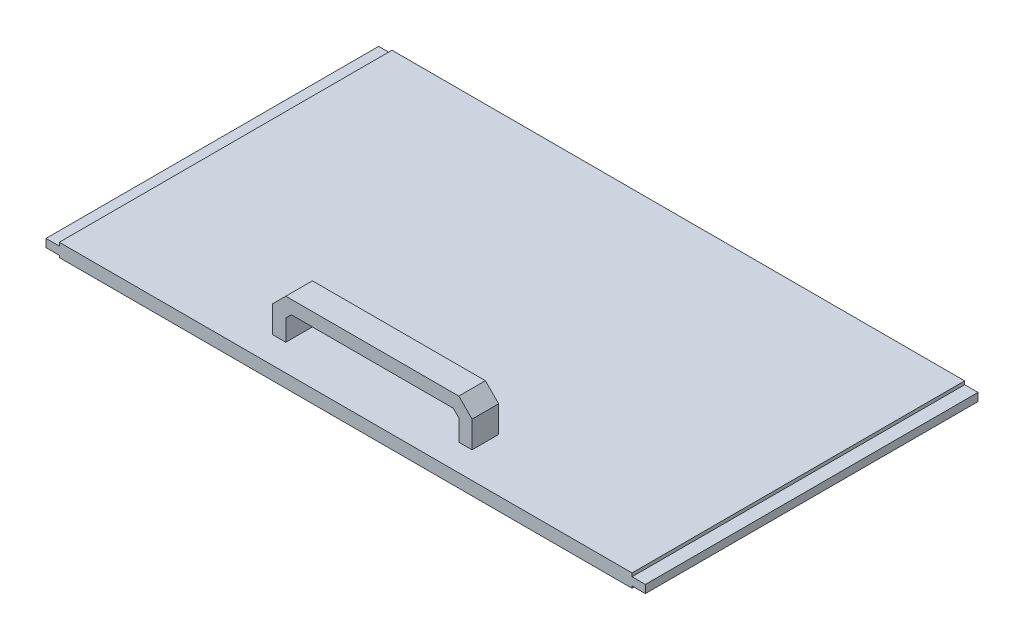
ISO-10303-21;
HEADER;
FILE_DESCRIPTION(('STEP AP214'),'2;1');
FILE_NAME('part.step','',(''),(''),'','','');
FILE_SCHEMA(('AUTOMOTIVE_DESIGN { 1 0 10303 214 1 1 1 1 }'));
ENDSEC;
DATA;
#1=APPLICATION_CONTEXT('core data for automotive mechanical design processes');
#2=APPLICATION_PROTOCOL_DEFINITION('international standard','automotive_design',2000,#1);
#3=PRODUCT_CONTEXT('',#1,'mechanical');
#4=PRODUCT('Part','Part','',(#3));
#5=PRODUCT_RELATED_PRODUCT_CATEGORY('part','',(#4));
#6=PRODUCT_DEFINITION_FORMATION('','',#4);
#7=PRODUCT_DEFINITION_CONTEXT('part definition',#1,'design');
#8=PRODUCT_DEFINITION('design','',#6,#7);
#9=PRODUCT_DEFINITION_SHAPE('','',#8);
#10=(LENGTH_UNIT() NAMED_UNIT(*) SI_UNIT(.MILLI.,.METRE.));
#11=(NAMED_UNIT(*) PLANE_ANGLE_UNIT() SI_UNIT($,.RADIAN.));
#12=(NAMED_UNIT(*) SI_UNIT($,.STERADIAN.) SOLID_ANGLE_UNIT());
#13=UNCERTAINTY_MEASURE_WITH_UNIT(LENGTH_MEASURE(1.E-05),#10,'distance_accuracy_value','');
#14=(GEOMETRIC_REPRESENTATION_CONTEXT(3) GLOBAL_UNCERTAINTY_ASSIGNED_CONTEXT((#13)) GLOBAL_UNIT_ASSIGNED_CONTEXT((#10,
#11,#12)) REPRESENTATION_CONTEXT('',''));
#15=CARTESIAN_POINT('',(0.,0.,0.));
#16=DIRECTION('',(0.,0.,1.));
#17=DIRECTION('',(1.,0.,0.));
#18=AXIS2_PLACEMENT_3D('',#15,#16,#17);
#19=CARTESIAN_POINT('',(0.,10.,0.));
#20=DIRECTION('',(0.,1.,0.));
#21=DIRECTION('',(0.,0.,1.));
#22=AXIS2_PLACEMENT_3D('',#19,#20,#21);
#23=PLANE('',#22);
#24=DIRECTION('',(1.,0.,0.));
#25=VECTOR('',#24,1.);
#26=CARTESIAN_POINT('',(-52.6814074074073,10.,106.184950617284));
#27=LINE('',#26,#25);
#28=CARTESIAN_POINT('',(87.3185925925926,10.,106.184950617284));
#29=VERTEX_POINT('',#28);
#30=CARTESIAN_POINT('',(97.3185925925927,10.,106.184950617284));
#31=VERTEX_POINT('',#30);
#32=EDGE_CURVE('E279',#29,#31,#27,.T.);
#33=ORIENTED_EDGE('',*,*,#32,.F.);
#34=DIRECTION('',(0.,0.,-1.));
#35=VECTOR('',#34,1.);
#36=CARTESIAN_POINT('',(87.3185925925926,10.,116.184950617284));
#37=LINE('',#36,#35);
#38=CARTESIAN_POINT('',(87.3185925925926,10.,86.1849506172838));
#39=VERTEX_POINT('',#38);
#40=EDGE_CURVE('E239',#29,#39,#37,.T.);
#41=ORIENTED_EDGE('',*,*,#40,.T.);
#42=DIRECTION('',(-1.,0.,0.));
#43=VECTOR('',#42,1.);
#44=CARTESIAN_POINT('',(97.3185925925926,10.,86.1849506172838));
#45=LINE('',#44,#43);
#46=CARTESIAN_POINT('',(97.3185925925926,10.,86.1849506172838));
#47=VERTEX_POINT('',#46);
#48=EDGE_CURVE('E271',#47,#39,#45,.T.);
#49=ORIENTED_EDGE('',*,*,#48,.F.);
#50=DIRECTION('',(0.,0.,-1.));
#51=VECTOR('',#50,1.);
#52=CARTESIAN_POINT('',(97.3185925925927,10.,106.184950617284));
#53=LINE('',#52,#51);
#54=EDGE_CURVE('E284',#31,#47,#53,.T.);
#55=ORIENTED_EDGE('',*,*,#54,.F.);
#56=EDGE_LOOP('',(#33,#41,#49,#55));
#57=FACE_BOUND('',#56,.T.);
#58=DIRECTION('',(0.,0.,-1.));
#59=VECTOR('',#58,1.);
#60=CARTESIAN_POINT('',(-42.6814074074074,10.,116.184950617284));
#61=LINE('',#60,#59);
#62=CARTESIAN_POINT('',(-42.6814074074074,10.,106.184950617284));
#63=VERTEX_POINT('',#62);
#64=CARTESIAN_POINT('',(-42.6814074074073,10.,86.1849506172839));
#65=VERTEX_POINT('',#64);
#66=EDGE_CURVE('E63',#63,#65,#61,.T.);
#67=ORIENTED_EDGE('',*,*,#66,.F.);
#68=CARTESIAN_POINT('',(-52.6814074074073,10.,106.184950617284));
#69=VERTEX_POINT('',#68);
#70=EDGE_CURVE('E280',#69,#63,#27,.T.);
#71=ORIENTED_EDGE('',*,*,#70,.F.);
#72=DIRECTION('',(0.,0.,1.));
#73=VECTOR('',#72,1.);
#74=CARTESIAN_POINT('',(-52.6814074074074,10.,86.1849506172839));
#75=LINE('',#74,#73);
#76=CARTESIAN_POINT('',(-52.6814074074074,10.,86.1849506172839));
#77=VERTEX_POINT('',#76);
#78=EDGE_CURVE('E266',#77,#69,#75,.T.);
#79=ORIENTED_EDGE('',*,*,#78,.F.);
#80=EDGE_CURVE('E288',#65,#77,#45,.T.);
#81=ORIENTED_EDGE('',*,*,#80,.F.);
#82=EDGE_LOOP('',(#67,#71,#79,#81));
#83=FACE_BOUND('',#82,.T.);
#84=DIRECTION('',(-1.,0.,0.));
#85=VECTOR('',#84,1.);
#86=CARTESIAN_POINT('',(237.533592592593,10.,-123.815049382716));
#87=LINE('',#86,#85);
#88=CARTESIAN_POINT('',(237.533592592593,10.,-123.815049382716));
#89=VERTEX_POINT('',#88);
#90=CARTESIAN_POINT('',(-192.896407407407,10.,-123.815049382716));
#91=VERTEX_POINT('',#90);
#92=EDGE_CURVE('E378',#89,#91,#87,.T.);
#93=ORIENTED_EDGE('',*,*,#92,.T.);
#94=DIRECTION('',(0.,0.,1.));
#95=VECTOR('',#94,1.);
#96=CARTESIAN_POINT('',(-192.896407407407,10.,-123.815049382716));
#97=LINE('',#96,#95);
#98=CARTESIAN_POINT('',(-192.896407407407,10.,126.184950617284));
#99=VERTEX_POINT('',#98);
#100=EDGE_CURVE('E382',#91,#99,#97,.T.);
#101=ORIENTED_EDGE('',*,*,#100,.T.);
#102=DIRECTION('',(1.,0.,0.));
#103=VECTOR('',#102,1.);
#104=CARTESIAN_POINT('',(-192.896407407407,10.,126.184950617284));
#105=LINE('',#104,#103);
#106=CARTESIAN_POINT('',(237.533592592593,10.,126.184950617284));
#107=VERTEX_POINT('',#106);
#108=EDGE_CURVE('E386',#99,#107,#105,.T.);
#109=ORIENTED_EDGE('',*,*,#108,.T.);
#110=DIRECTION('',(0.,0.,-1.));
#111=VECTOR('',#110,1.);
#112=CARTESIAN_POINT('',(237.533592592593,10.,126.184950617284));
#113=LINE('',#112,#111);
#114=EDGE_CURVE('E389',#107,#89,#113,.T.);
#115=ORIENTED_EDGE('',*,*,#114,.T.);
#116=EDGE_LOOP('',(#93,#101,#109,#115));
#117=FACE_BOUND('',#116,.T.);
#118=ADVANCED_FACE('F41',(#57,#83,#117),#23,.T.);
#119=CARTESIAN_POINT('',(-192.896407407407,10.,-123.815049382716));
#120=DIRECTION('',(1.,0.,0.));
#121=DIRECTION('',(0.,0.,-1.));
#122=AXIS2_PLACEMENT_3D('',#119,#120,#121);
#123=PLANE('',#122);
#124=DIRECTION('',(0.,-1.,0.));
#125=VECTOR('',#124,1.);
#126=CARTESIAN_POINT('',(-192.896407407407,10.,-123.815049382716));
#127=LINE('',#126,#125);
#128=CARTESIAN_POINT('',(-192.896407407407,7.50000000000003,-123.815049382716));
#129=VERTEX_POINT('',#128);
#130=EDGE_CURVE('E421',#91,#129,#127,.T.);
#131=ORIENTED_EDGE('',*,*,#130,.T.);
#132=DIRECTION('',(0.,0.,1.));
#133=VECTOR('',#132,1.);
#134=CARTESIAN_POINT('',(-192.896407407407,7.50000000000003,-123.815049382716));
#135=LINE('',#134,#133);
#136=CARTESIAN_POINT('',(-192.896407407407,7.5,126.184950617284));
#137=VERTEX_POINT('',#136);
#138=EDGE_CURVE('E304',#129,#137,#135,.T.);
#139=ORIENTED_EDGE('',*,*,#138,.T.);
#140=DIRECTION('',(0.,-1.,0.));
#141=VECTOR('',#140,1.);
#142=CARTESIAN_POINT('',(-192.896407407407,10.,126.184950617284));
#143=LINE('',#142,#141);
#144=EDGE_CURVE('E416',#99,#137,#143,.T.);
#145=ORIENTED_EDGE('',*,*,#144,.F.);
#146=ORIENTED_EDGE('',*,*,#100,.F.);
#147=EDGE_LOOP('',(#131,#139,#145,#146));
#148=FACE_BOUND('',#147,.T.);
#149=ADVANCED_FACE('F527',(#148),#123,.F.);
#150=CARTESIAN_POINT('',(237.533592592593,10.,126.184950617284));
#151=DIRECTION('',(-1.,0.,0.));
#152=DIRECTION('',(0.,0.,1.));
#153=AXIS2_PLACEMENT_3D('',#150,#151,#152);
#154=PLANE('',#153);
#155=DIRECTION('',(0.,0.,1.));
#156=VECTOR('',#155,1.);
#157=CARTESIAN_POINT('',(237.533592592593,7.50000000000003,-123.815049382716));
#158=LINE('',#157,#156);
#159=CARTESIAN_POINT('',(237.533592592593,7.50000000000002,-123.815049382716));
#160=VERTEX_POINT('',#159);
#161=CARTESIAN_POINT('',(237.533592592593,7.50000000000002,126.184950617284));
#162=VERTEX_POINT('',#161);
#163=EDGE_CURVE('E340',#160,#162,#158,.T.);
#164=ORIENTED_EDGE('',*,*,#163,.F.);
#165=DIRECTION('',(0.,-1.,0.));
#166=VECTOR('',#165,1.);
#167=CARTESIAN_POINT('',(237.533592592593,10.,-123.815049382716));
#168=LINE('',#167,#166);
#169=EDGE_CURVE('E407',#89,#160,#168,.T.);
#170=ORIENTED_EDGE('',*,*,#169,.F.);
#171=ORIENTED_EDGE('',*,*,#114,.F.);
#172=DIRECTION('',(0.,-1.,0.));
#173=VECTOR('',#172,1.);
#174=CARTESIAN_POINT('',(237.533592592593,10.,126.184950617284));
#175=LINE('',#174,#173);
#176=EDGE_CURVE('E412',#107,#162,#175,.T.);
#177=ORIENTED_EDGE('',*,*,#176,.T.);
#178=EDGE_LOOP('',(#164,#170,#171,#177));
#179=FACE_BOUND('',#178,.T.);
#180=ADVANCED_FACE('F534',(#179),#154,.F.);
#181=DIRECTION('',(0.,0.,-1.));
#182=VECTOR('',#181,1.);
#183=CARTESIAN_POINT('',(237.533592592593,1.5,126.184950617284));
#184=LINE('',#183,#182);
#185=CARTESIAN_POINT('',(237.533592592593,1.5,126.184950617284));
#186=VERTEX_POINT('',#185);
#187=CARTESIAN_POINT('',(237.533592592593,1.5,-123.815049382716));
#188=VERTEX_POINT('',#187);
#189=EDGE_CURVE('E346',#186,#188,#184,.T.);
#190=ORIENTED_EDGE('',*,*,#189,.F.);
#191=CARTESIAN_POINT('',(237.533592592593,0.,126.184950617284));
#192=VERTEX_POINT('',#191);
#193=EDGE_CURVE('E411',#186,#192,#175,.T.);
#194=ORIENTED_EDGE('',*,*,#193,.T.);
#195=DIRECTION('',(0.,0.,-1.));
#196=VECTOR('',#195,1.);
#197=CARTESIAN_POINT('',(237.533592592593,0.,126.184950617284));
#198=LINE('',#197,#196);
#199=CARTESIAN_POINT('',(237.533592592593,0.,-123.815049382716));
#200=VERTEX_POINT('',#199);
#201=EDGE_CURVE('E383',#192,#200,#198,.T.);
#202=ORIENTED_EDGE('',*,*,#201,.T.);
#203=EDGE_CURVE('E392',#188,#200,#168,.T.);
#204=ORIENTED_EDGE('',*,*,#203,.F.);
#205=EDGE_LOOP('',(#190,#194,#202,#204));
#206=FACE_BOUND('',#205,.T.);
#207=ADVANCED_FACE('F508',(#206),#154,.F.);
#208=CARTESIAN_POINT('',(237.533592592593,10.,-123.815049382716));
#209=DIRECTION('',(0.,0.,1.));
#210=DIRECTION('',(1.,0.,0.));
#211=AXIS2_PLACEMENT_3D('',#208,#209,#210);
#212=PLANE('',#211);
#213=DIRECTION('',(-1.,0.,0.));
#214=VECTOR('',#213,1.);
#215=CARTESIAN_POINT('',(237.533592592593,0.,-123.815049382716));
#216=LINE('',#215,#214);
#217=CARTESIAN_POINT('',(-192.896407407407,0.,-123.815049382716));
#218=VERTEX_POINT('',#217);
#219=EDGE_CURVE('E377',#200,#218,#216,.T.);
#220=ORIENTED_EDGE('',*,*,#219,.T.);
#221=CARTESIAN_POINT('',(-192.896407407407,1.5,-123.815049382716));
#222=VERTEX_POINT('',#221);
#223=EDGE_CURVE('E420',#222,#218,#127,.T.);
#224=ORIENTED_EDGE('',*,*,#223,.F.);
#225=DIRECTION('',(1.,0.,0.));
#226=VECTOR('',#225,1.);
#227=CARTESIAN_POINT('',(-202.896407407407,1.5,-123.815049382716));
#228=LINE('',#227,#226);
#229=CARTESIAN_POINT('',(-202.896407407407,1.5,-123.815049382716));
#230=VERTEX_POINT('',#229);
#231=EDGE_CURVE('E334',#230,#222,#228,.T.);
#232=ORIENTED_EDGE('',*,*,#231,.F.);
#233=DIRECTION('',(0.,1.,0.));
#234=VECTOR('',#233,1.);
#235=CARTESIAN_POINT('',(-202.896407407407,1.5,-123.815049382716));
#236=LINE('',#235,#234);
#237=CARTESIAN_POINT('',(-202.896407407407,7.50000000000003,-123.815049382716));
#238=VERTEX_POINT('',#237);
#239=EDGE_CURVE('E309',#230,#238,#236,.T.);
#240=ORIENTED_EDGE('',*,*,#239,.T.);
#241=DIRECTION('',(1.,0.,0.));
#242=VECTOR('',#241,1.);
#243=CARTESIAN_POINT('',(-202.896407407407,7.50000000000003,-123.815049382716));
#244=LINE('',#243,#242);
#245=EDGE_CURVE('E337',#238,#129,#244,.T.);
#246=ORIENTED_EDGE('',*,*,#245,.T.);
#247=ORIENTED_EDGE('',*,*,#130,.F.);
#248=ORIENTED_EDGE('',*,*,#92,.F.);
#249=ORIENTED_EDGE('',*,*,#169,.T.);
#250=DIRECTION('',(-1.,0.,0.));
#251=VECTOR('',#250,1.);
#252=CARTESIAN_POINT('',(247.533592592593,7.50000000000003,-123.815049382716));
#253=LINE('',#252,#251);
#254=CARTESIAN_POINT('',(247.533592592593,7.50000000000003,-123.815049382716));
#255=VERTEX_POINT('',#254);
#256=EDGE_CURVE('E355',#255,#160,#253,.T.);
#257=ORIENTED_EDGE('',*,*,#256,.F.);
#258=DIRECTION('',(0.,1.,0.));
#259=VECTOR('',#258,1.);
#260=CARTESIAN_POINT('',(247.533592592593,1.5,-123.815049382716));
#261=LINE('',#260,#259);
#262=CARTESIAN_POINT('',(247.533592592593,1.5,-123.815049382716));
#263=VERTEX_POINT('',#262);
#264=EDGE_CURVE('E352',#263,#255,#261,.T.);
#265=ORIENTED_EDGE('',*,*,#264,.F.);
#266=DIRECTION('',(-1.,0.,0.));
#267=VECTOR('',#266,1.);
#268=CARTESIAN_POINT('',(247.533592592593,1.5,-123.815049382716));
#269=LINE('',#268,#267);
#270=EDGE_CURVE('E365',#263,#188,#269,.T.);
#271=ORIENTED_EDGE('',*,*,#270,.T.);
#272=ORIENTED_EDGE('',*,*,#203,.T.);
#273=EDGE_LOOP('',(#220,#224,#232,#240,#246,#247,#248,#249,#257,#265,#271,#272));
#274=FACE_BOUND('',#273,.T.);
#275=ADVANCED_FACE('F504',(#274),#212,.F.);
#276=CARTESIAN_POINT('',(-192.896407407407,1.5,126.184950617284));
#277=VERTEX_POINT('',#276);
#278=CARTESIAN_POINT('',(-192.896407407407,0.,126.184950617284));
#279=VERTEX_POINT('',#278);
#280=EDGE_CURVE('E415',#277,#279,#143,.T.);
#281=ORIENTED_EDGE('',*,*,#280,.F.);
#282=DIRECTION('',(0.,0.,-1.));
#283=VECTOR('',#282,1.);
#284=CARTESIAN_POINT('',(-192.896407407407,1.5,126.184950617284));
#285=LINE('',#284,#283);
#286=EDGE_CURVE('E310',#277,#222,#285,.T.);
#287=ORIENTED_EDGE('',*,*,#286,.T.);
#288=ORIENTED_EDGE('',*,*,#223,.T.);
#289=DIRECTION('',(0.,0.,1.));
#290=VECTOR('',#289,1.);
#291=CARTESIAN_POINT('',(-192.896407407407,0.,-123.815049382716));
#292=LINE('',#291,#290);
#293=EDGE_CURVE('E396',#218,#279,#292,.T.);
#294=ORIENTED_EDGE('',*,*,#293,.T.);
#295=EDGE_LOOP('',(#281,#287,#288,#294));
#296=FACE_BOUND('',#295,.T.);
#297=ADVANCED_FACE('F496',(#296),#123,.F.);
#298=CARTESIAN_POINT('',(-192.896407407407,10.,126.184950617284));
#299=DIRECTION('',(0.,0.,-1.));
#300=DIRECTION('',(-1.,0.,0.));
#301=AXIS2_PLACEMENT_3D('',#298,#299,#300);
#302=PLANE('',#301);
#303=DIRECTION('',(1.,0.,0.));
#304=VECTOR('',#303,1.);
#305=CARTESIAN_POINT('',(-192.896407407407,0.,126.184950617284));
#306=LINE('',#305,#304);
#307=EDGE_CURVE('E400',#279,#192,#306,.T.);
#308=ORIENTED_EDGE('',*,*,#307,.T.);
#309=ORIENTED_EDGE('',*,*,#193,.F.);
#310=DIRECTION('',(-1.,0.,0.));
#311=VECTOR('',#310,1.);
#312=CARTESIAN_POINT('',(247.533592592593,1.5,126.184950617284));
#313=LINE('',#312,#311);
#314=CARTESIAN_POINT('',(247.533592592593,1.5,126.184950617284));
#315=VERTEX_POINT('',#314);
#316=EDGE_CURVE('E369',#315,#186,#313,.T.);
#317=ORIENTED_EDGE('',*,*,#316,.F.);
#318=DIRECTION('',(0.,-1.,0.));
#319=VECTOR('',#318,1.);
#320=CARTESIAN_POINT('',(247.533592592593,7.5,126.184950617284));
#321=LINE('',#320,#319);
#322=CARTESIAN_POINT('',(247.533592592593,7.5,126.184950617284));
#323=VERTEX_POINT('',#322);
#324=EDGE_CURVE('E345',#323,#315,#321,.T.);
#325=ORIENTED_EDGE('',*,*,#324,.F.);
#326=DIRECTION('',(-1.,0.,0.));
#327=VECTOR('',#326,1.);
#328=CARTESIAN_POINT('',(247.533592592593,7.5,126.184950617284));
#329=LINE('',#328,#327);
#330=EDGE_CURVE('E373',#323,#162,#329,.T.);
#331=ORIENTED_EDGE('',*,*,#330,.T.);
#332=ORIENTED_EDGE('',*,*,#176,.F.);
#333=ORIENTED_EDGE('',*,*,#108,.F.);
#334=ORIENTED_EDGE('',*,*,#144,.T.);
#335=DIRECTION('',(1.,0.,0.));
#336=VECTOR('',#335,1.);
#337=CARTESIAN_POINT('',(-202.896407407407,7.5,126.184950617284));
#338=LINE('',#337,#336);
#339=CARTESIAN_POINT('',(-202.896407407407,7.5,126.184950617284));
#340=VERTEX_POINT('',#339);
#341=EDGE_CURVE('E322',#340,#137,#338,.T.);
#342=ORIENTED_EDGE('',*,*,#341,.F.);
#343=DIRECTION('',(0.,-1.,0.));
#344=VECTOR('',#343,1.);
#345=CARTESIAN_POINT('',(-202.896407407407,7.5,126.184950617284));
#346=LINE('',#345,#344);
#347=CARTESIAN_POINT('',(-202.896407407407,1.5,126.184950617284));
#348=VERTEX_POINT('',#347);
#349=EDGE_CURVE('E318',#340,#348,#346,.T.);
#350=ORIENTED_EDGE('',*,*,#349,.T.);
#351=DIRECTION('',(1.,0.,0.));
#352=VECTOR('',#351,1.);
#353=CARTESIAN_POINT('',(-202.896407407407,1.5,126.184950617284));
#354=LINE('',#353,#352);
#355=EDGE_CURVE('E331',#348,#277,#354,.T.);
#356=ORIENTED_EDGE('',*,*,#355,.T.);
#357=ORIENTED_EDGE('',*,*,#280,.T.);
#358=EDGE_LOOP('',(#308,#309,#317,#325,#331,#332,#333,#334,#342,#350,#356,#357));
#359=FACE_BOUND('',#358,.T.);
#360=ADVANCED_FACE('F512',(#359),#302,.F.);
#361=CARTESIAN_POINT('',(0.,0.,0.));
#362=DIRECTION('',(0.,1.,0.));
#363=DIRECTION('',(0.,0.,1.));
#364=AXIS2_PLACEMENT_3D('',#361,#362,#363);
#365=PLANE('',#364);
#366=ORIENTED_EDGE('',*,*,#219,.F.);
#367=ORIENTED_EDGE('',*,*,#201,.F.);
#368=ORIENTED_EDGE('',*,*,#307,.F.);
#369=ORIENTED_EDGE('',*,*,#293,.F.);
#370=EDGE_LOOP('',(#366,#367,#368,#369));
#371=FACE_BOUND('',#370,.T.);
#372=ADVANCED_FACE('F502',(#371),#365,.F.);
#373=CARTESIAN_POINT('',(247.533592592593,7.50000000000003,-123.815049382716));
#374=DIRECTION('',(0.,-1.,0.));
#375=DIRECTION('',(0.,0.,-1.));
#376=AXIS2_PLACEMENT_3D('',#373,#374,#375);
#377=PLANE('',#376);
#378=ORIENTED_EDGE('',*,*,#163,.T.);
#379=ORIENTED_EDGE('',*,*,#330,.F.);
#380=DIRECTION('',(0.,0.,1.));
#381=VECTOR('',#380,1.);
#382=CARTESIAN_POINT('',(247.533592592593,7.50000000000003,-123.815049382716));
#383=LINE('',#382,#381);
#384=EDGE_CURVE('E341',#255,#323,#383,.T.);
#385=ORIENTED_EDGE('',*,*,#384,.F.);
#386=ORIENTED_EDGE('',*,*,#256,.T.);
#387=EDGE_LOOP('',(#378,#379,#385,#386));
#388=FACE_BOUND('',#387,.T.);
#389=ADVANCED_FACE('F538',(#388),#377,.F.);
#390=CARTESIAN_POINT('',(247.533592592593,1.5,126.184950617284));
#391=DIRECTION('',(0.,1.,0.));
#392=DIRECTION('',(0.,0.,1.));
#393=AXIS2_PLACEMENT_3D('',#390,#391,#392);
#394=PLANE('',#393);
#395=ORIENTED_EDGE('',*,*,#189,.T.);
#396=ORIENTED_EDGE('',*,*,#270,.F.);
#397=DIRECTION('',(0.,0.,-1.));
#398=VECTOR('',#397,1.);
#399=CARTESIAN_POINT('',(247.533592592593,1.5,126.184950617284));
#400=LINE('',#399,#398);
#401=EDGE_CURVE('E349',#315,#263,#400,.T.);
#402=ORIENTED_EDGE('',*,*,#401,.F.);
#403=ORIENTED_EDGE('',*,*,#316,.T.);
#404=EDGE_LOOP('',(#395,#396,#402,#403));
#405=FACE_BOUND('',#404,.T.);
#406=ADVANCED_FACE('F544',(#405),#394,.F.);
#407=CARTESIAN_POINT('',(247.533592592593,0.,0.));
#408=DIRECTION('',(1.,0.,0.));
#409=DIRECTION('',(0.,0.,-1.));
#410=AXIS2_PLACEMENT_3D('',#407,#408,#409);
#411=PLANE('',#410);
#412=ORIENTED_EDGE('',*,*,#384,.T.);
#413=ORIENTED_EDGE('',*,*,#324,.T.);
#414=ORIENTED_EDGE('',*,*,#401,.T.);
#415=ORIENTED_EDGE('',*,*,#264,.T.);
#416=EDGE_LOOP('',(#412,#413,#414,#415));
#417=FACE_BOUND('',#416,.T.);
#418=ADVANCED_FACE('F541',(#417),#411,.T.);
#419=CARTESIAN_POINT('',(-202.896407407407,7.50000000000003,-123.815049382716));
#420=DIRECTION('',(0.,1.,0.));
#421=DIRECTION('',(0.,0.,1.));
#422=AXIS2_PLACEMENT_3D('',#419,#420,#421);
#423=PLANE('',#422);
#424=ORIENTED_EDGE('',*,*,#138,.F.);
#425=ORIENTED_EDGE('',*,*,#245,.F.);
#426=DIRECTION('',(0.,0.,1.));
#427=VECTOR('',#426,1.);
#428=CARTESIAN_POINT('',(-202.896407407407,7.50000000000003,-123.815049382716));
#429=LINE('',#428,#427);
#430=EDGE_CURVE('E305',#238,#340,#429,.T.);
#431=ORIENTED_EDGE('',*,*,#430,.T.);
#432=ORIENTED_EDGE('',*,*,#341,.T.);
#433=EDGE_LOOP('',(#424,#425,#431,#432));
#434=FACE_BOUND('',#433,.T.);
#435=ADVANCED_FACE('F523',(#434),#423,.T.);
#436=CARTESIAN_POINT('',(-202.896407407407,1.5,126.184950617284));
#437=DIRECTION('',(0.,-1.,0.));
#438=DIRECTION('',(0.,0.,-1.));
#439=AXIS2_PLACEMENT_3D('',#436,#437,#438);
#440=PLANE('',#439);
#441=ORIENTED_EDGE('',*,*,#286,.F.);
#442=ORIENTED_EDGE('',*,*,#355,.F.);
#443=DIRECTION('',(0.,0.,-1.));
#444=VECTOR('',#443,1.);
#445=CARTESIAN_POINT('',(-202.896407407407,1.5,126.184950617284));
#446=LINE('',#445,#444);
#447=EDGE_CURVE('E314',#348,#230,#446,.T.);
#448=ORIENTED_EDGE('',*,*,#447,.T.);
#449=ORIENTED_EDGE('',*,*,#231,.T.);
#450=EDGE_LOOP('',(#441,#442,#448,#449));
#451=FACE_BOUND('',#450,.T.);
#452=ADVANCED_FACE('F516',(#451),#440,.T.);
#453=CARTESIAN_POINT('',(-202.896407407407,0.,0.));
#454=DIRECTION('',(-1.,0.,0.));
#455=DIRECTION('',(0.,0.,-1.));
#456=AXIS2_PLACEMENT_3D('',#453,#454,#455);
#457=PLANE('',#456);
#458=ORIENTED_EDGE('',*,*,#430,.F.);
#459=ORIENTED_EDGE('',*,*,#239,.F.);
#460=ORIENTED_EDGE('',*,*,#447,.F.);
#461=ORIENTED_EDGE('',*,*,#349,.F.);
#462=EDGE_LOOP('',(#458,#459,#460,#461));
#463=FACE_BOUND('',#462,.T.);
#464=ADVANCED_FACE('F520',(#463),#457,.T.);
#465=CARTESIAN_POINT('',(-52.6814074074074,40.,86.1849506172839));
#466=DIRECTION('',(1.,0.,0.));
#467=DIRECTION('',(0.,0.,-1.));
#468=AXIS2_PLACEMENT_3D('',#465,#466,#467);
#469=PLANE('',#468);
#470=DIRECTION('',(0.,-1.,0.));
#471=VECTOR('',#470,1.);
#472=CARTESIAN_POINT('',(-52.6814074074073,40.,106.184950617284));
#473=LINE('',#472,#471);
#474=CARTESIAN_POINT('',(-52.6814074074073,30.,106.184950617284));
#475=VERTEX_POINT('',#474);
#476=EDGE_CURVE('E301',#475,#69,#473,.T.);
#477=ORIENTED_EDGE('',*,*,#476,.F.);
#478=DIRECTION('',(0.,0.,-1.));
#479=VECTOR('',#478,1.);
#480=CARTESIAN_POINT('',(-52.6814074074074,30.,86.1849506172839));
#481=LINE('',#480,#479);
#482=CARTESIAN_POINT('',(-52.6814074074074,30.,86.1849506172839));
#483=VERTEX_POINT('',#482);
#484=EDGE_CURVE('E51',#475,#483,#481,.T.);
#485=ORIENTED_EDGE('',*,*,#484,.T.);
#486=DIRECTION('',(0.,-1.,0.));
#487=VECTOR('',#486,1.);
#488=CARTESIAN_POINT('',(-52.6814074074074,40.,86.1849506172839));
#489=LINE('',#488,#487);
#490=EDGE_CURVE('E275',#483,#77,#489,.T.);
#491=ORIENTED_EDGE('',*,*,#490,.T.);
#492=ORIENTED_EDGE('',*,*,#78,.T.);
#493=EDGE_LOOP('',(#477,#485,#491,#492));
#494=FACE_BOUND('',#493,.T.);
#495=ADVANCED_FACE('F450',(#494),#469,.F.);
#496=CARTESIAN_POINT('',(-52.6814074074073,40.,106.184950617284));
#497=DIRECTION('',(0.,0.,-1.));
#498=DIRECTION('',(-1.,0.,0.));
#499=AXIS2_PLACEMENT_3D('',#496,#497,#498);
#500=PLANE('',#499);
#501=DIRECTION('',(0.707106781186545,-0.70710678118655,0.));
#502=VECTOR('',#501,1.);
#503=CARTESIAN_POINT('',(10.2475247807276,102.928932188135,106.184950617284));
#504=LINE('',#503,#502);
#505=CARTESIAN_POINT('',(83.1764569688617,30.,106.184950617284));
#506=VERTEX_POINT('',#505);
#507=CARTESIAN_POINT('',(87.3185925925926,25.8578643762691,106.184950617284));
#508=VERTEX_POINT('',#507);
#509=EDGE_CURVE('E258',#506,#508,#504,.T.);
#510=ORIENTED_EDGE('',*,*,#509,.T.);
#511=DIRECTION('',(0.,-1.,0.));
#512=VECTOR('',#511,1.);
#513=CARTESIAN_POINT('',(87.3185925925926,40.,106.184950617284));
#514=LINE('',#513,#512);
#515=EDGE_CURVE('E262',#508,#29,#514,.T.);
#516=ORIENTED_EDGE('',*,*,#515,.T.);
#517=ORIENTED_EDGE('',*,*,#32,.T.);
#518=DIRECTION('',(0.,-1.,0.));
#519=VECTOR('',#518,1.);
#520=CARTESIAN_POINT('',(97.3185925925927,40.,106.184950617284));
#521=LINE('',#520,#519);
#522=CARTESIAN_POINT('',(97.3185925925927,30.,106.184950617284));
#523=VERTEX_POINT('',#522);
#524=EDGE_CURVE('E297',#523,#31,#521,.T.);
#525=ORIENTED_EDGE('',*,*,#524,.F.);
#526=DIRECTION('',(-0.707106781186545,0.70710678118655,0.));
#527=VECTOR('',#526,1.);
#528=CARTESIAN_POINT('',(87.3185925925927,40.,106.184950617284));
#529=LINE('',#528,#527);
#530=CARTESIAN_POINT('',(87.3185925925927,40.,106.184950617284));
#531=VERTEX_POINT('',#530);
#532=EDGE_CURVE('E435',#523,#531,#529,.T.);
#533=ORIENTED_EDGE('',*,*,#532,.T.);
#534=DIRECTION('',(1.,0.,0.));
#535=VECTOR('',#534,1.);
#536=CARTESIAN_POINT('',(-52.6814074074073,40.,106.184950617284));
#537=LINE('',#536,#535);
#538=CARTESIAN_POINT('',(-42.6814074074074,40.,106.184950617284));
#539=VERTEX_POINT('',#538);
#540=EDGE_CURVE('E267',#539,#531,#537,.T.);
#541=ORIENTED_EDGE('',*,*,#540,.F.);
#542=DIRECTION('',(-0.707106781186543,-0.707106781186552,0.));
#543=VECTOR('',#542,1.);
#544=CARTESIAN_POINT('',(-42.6814074074075,40.,106.184950617284));
#545=LINE('',#544,#543);
#546=EDGE_CURVE('E443',#539,#475,#545,.T.);
#547=ORIENTED_EDGE('',*,*,#546,.T.);
#548=ORIENTED_EDGE('',*,*,#476,.T.);
#549=ORIENTED_EDGE('',*,*,#70,.T.);
#550=DIRECTION('',(0.,1.,0.));
#551=VECTOR('',#550,1.);
#552=CARTESIAN_POINT('',(-42.6814074074073,40.,106.184950617284));
#553=LINE('',#552,#551);
#554=CARTESIAN_POINT('',(-42.6814074074073,25.8578643762691,106.184950617284));
#555=VERTEX_POINT('',#554);
#556=EDGE_CURVE('E238',#63,#555,#553,.T.);
#557=ORIENTED_EDGE('',*,*,#556,.T.);
#558=DIRECTION('',(0.707106781186544,0.707106781186551,0.));
#559=VECTOR('',#558,1.);
#560=CARTESIAN_POINT('',(-40.6103395955418,27.9289321881346,106.184950617284));
#561=LINE('',#560,#559);
#562=CARTESIAN_POINT('',(-38.5392717836765,30.,106.184950617284));
#563=VERTEX_POINT('',#562);
#564=EDGE_CURVE('E207',#555,#563,#561,.T.);
#565=ORIENTED_EDGE('',*,*,#564,.T.);
#566=DIRECTION('',(1.,0.,0.));
#567=VECTOR('',#566,1.);
#568=CARTESIAN_POINT('',(-52.6814074074073,30.,106.184950617284));
#569=LINE('',#568,#567);
#570=EDGE_CURVE('E254',#563,#506,#569,.T.);
#571=ORIENTED_EDGE('',*,*,#570,.T.);
#572=EDGE_LOOP('',(#510,#516,#517,#525,#533,#541,#547,#548,#549,#557,#565,#571));
#573=FACE_BOUND('',#572,.T.);
#574=ADVANCED_FACE('F460',(#573),#500,.F.);
#575=CARTESIAN_POINT('',(97.3185925925927,40.,106.184950617284));
#576=DIRECTION('',(-1.,0.,0.));
#577=DIRECTION('',(0.,0.,1.));
#578=AXIS2_PLACEMENT_3D('',#575,#576,#577);
#579=PLANE('',#578);
#580=DIRECTION('',(0.,-1.,0.));
#581=VECTOR('',#580,1.);
#582=CARTESIAN_POINT('',(97.3185925925926,40.,86.1849506172838));
#583=LINE('',#582,#581);
#584=CARTESIAN_POINT('',(97.3185925925926,30.,86.1849506172838));
#585=VERTEX_POINT('',#584);
#586=EDGE_CURVE('E294',#585,#47,#583,.T.);
#587=ORIENTED_EDGE('',*,*,#586,.F.);
#588=DIRECTION('',(0.,0.,1.));
#589=VECTOR('',#588,1.);
#590=CARTESIAN_POINT('',(97.3185925925927,30.,106.184950617284));
#591=LINE('',#590,#589);
#592=EDGE_CURVE('E432',#585,#523,#591,.T.);
#593=ORIENTED_EDGE('',*,*,#592,.T.);
#594=ORIENTED_EDGE('',*,*,#524,.T.);
#595=ORIENTED_EDGE('',*,*,#54,.T.);
#596=EDGE_LOOP('',(#587,#593,#594,#595));
#597=FACE_BOUND('',#596,.T.);
#598=ADVANCED_FACE('F469',(#597),#579,.F.);
#599=CARTESIAN_POINT('',(97.3185925925926,40.,86.1849506172838));
#600=DIRECTION('',(0.,0.,1.));
#601=DIRECTION('',(1.,0.,0.));
#602=AXIS2_PLACEMENT_3D('',#599,#600,#601);
#603=PLANE('',#602);
#604=ORIENTED_EDGE('',*,*,#48,.T.);
#605=DIRECTION('',(0.,-1.,0.));
#606=VECTOR('',#605,1.);
#607=CARTESIAN_POINT('',(87.3185925925926,20.,86.1849506172838));
#608=LINE('',#607,#606);
#609=CARTESIAN_POINT('',(87.3185925925926,25.8578643762691,86.1849506172838));
#610=VERTEX_POINT('',#609);
#611=EDGE_CURVE('E211',#610,#39,#608,.T.);
#612=ORIENTED_EDGE('',*,*,#611,.F.);
#613=DIRECTION('',(0.707106781186545,-0.70710678118655,0.));
#614=VECTOR('',#613,1.);
#615=CARTESIAN_POINT('',(83.1764569688617,30.,86.1849506172838));
#616=LINE('',#615,#614);
#617=CARTESIAN_POINT('',(83.1764569688617,30.,86.1849506172838));
#618=VERTEX_POINT('',#617);
#619=EDGE_CURVE('E227',#618,#610,#616,.T.);
#620=ORIENTED_EDGE('',*,*,#619,.F.);
#621=DIRECTION('',(1.,0.,0.));
#622=VECTOR('',#621,1.);
#623=CARTESIAN_POINT('',(-38.5392717836765,30.,86.1849506172839));
#624=LINE('',#623,#622);
#625=CARTESIAN_POINT('',(-38.5392717836765,30.,86.1849506172839));
#626=VERTEX_POINT('',#625);
#627=EDGE_CURVE('E223',#626,#618,#624,.T.);
#628=ORIENTED_EDGE('',*,*,#627,.F.);
#629=DIRECTION('',(0.707106781186544,0.707106781186551,0.));
#630=VECTOR('',#629,1.);
#631=CARTESIAN_POINT('',(-42.6814074074074,25.8578643762691,86.1849506172839));
#632=LINE('',#631,#630);
#633=CARTESIAN_POINT('',(-42.6814074074074,25.8578643762691,86.1849506172839));
#634=VERTEX_POINT('',#633);
#635=EDGE_CURVE('E204',#634,#626,#632,.T.);
#636=ORIENTED_EDGE('',*,*,#635,.F.);
#637=DIRECTION('',(0.,1.,0.));
#638=VECTOR('',#637,1.);
#639=CARTESIAN_POINT('',(-42.6814074074074,20.,86.1849506172839));
#640=LINE('',#639,#638);
#641=EDGE_CURVE('E213',#65,#634,#640,.T.);
#642=ORIENTED_EDGE('',*,*,#641,.F.);
#643=ORIENTED_EDGE('',*,*,#80,.T.);
#644=ORIENTED_EDGE('',*,*,#490,.F.);
#645=DIRECTION('',(0.707106781186543,0.707106781186552,0.));
#646=VECTOR('',#645,1.);
#647=CARTESIAN_POINT('',(-42.6814074074075,40.,86.1849506172839));
#648=LINE('',#647,#646);
#649=CARTESIAN_POINT('',(-42.6814074074075,40.,86.1849506172839));
#650=VERTEX_POINT('',#649);
#651=EDGE_CURVE('E11',#483,#650,#648,.T.);
#652=ORIENTED_EDGE('',*,*,#651,.T.);
#653=DIRECTION('',(-1.,0.,0.));
#654=VECTOR('',#653,1.);
#655=CARTESIAN_POINT('',(97.3185925925926,40.,86.1849506172838));
#656=LINE('',#655,#654);
#657=CARTESIAN_POINT('',(87.3185925925927,40.,86.1849506172838));
#658=VERTEX_POINT('',#657);
#659=EDGE_CURVE('E270',#658,#650,#656,.T.);
#660=ORIENTED_EDGE('',*,*,#659,.F.);
#661=DIRECTION('',(0.707106781186545,-0.70710678118655,0.));
#662=VECTOR('',#661,1.);
#663=CARTESIAN_POINT('',(87.3185925925927,40.,86.1849506172838));
#664=LINE('',#663,#662);
#665=EDGE_CURVE('E429',#658,#585,#664,.T.);
#666=ORIENTED_EDGE('',*,*,#665,.T.);
#667=ORIENTED_EDGE('',*,*,#586,.T.);
#668=EDGE_LOOP('',(#604,#612,#620,#628,#636,#642,#643,#644,#652,#660,#666,#667));
#669=FACE_BOUND('',#668,.T.);
#670=ADVANCED_FACE('F220',(#669),#603,.F.);
#671=CARTESIAN_POINT('',(0.,40.,0.));
#672=DIRECTION('',(0.,1.,0.));
#673=DIRECTION('',(0.,0.,1.));
#674=AXIS2_PLACEMENT_3D('',#671,#672,#673);
#675=PLANE('',#674);
#676=ORIENTED_EDGE('',*,*,#659,.T.);
#677=DIRECTION('',(0.,0.,1.));
#678=VECTOR('',#677,1.);
#679=CARTESIAN_POINT('',(-42.6814074074074,40.,106.184950617284));
#680=LINE('',#679,#678);
#681=EDGE_CURVE('E439',#650,#539,#680,.T.);
#682=ORIENTED_EDGE('',*,*,#681,.T.);
#683=ORIENTED_EDGE('',*,*,#540,.T.);
#684=DIRECTION('',(0.,0.,-1.));
#685=VECTOR('',#684,1.);
#686=CARTESIAN_POINT('',(87.3185925925927,40.,86.1849506172838));
#687=LINE('',#686,#685);
#688=EDGE_CURVE('E425',#531,#658,#687,.T.);
#689=ORIENTED_EDGE('',*,*,#688,.T.);
#690=EDGE_LOOP('',(#676,#682,#683,#689));
#691=FACE_BOUND('',#690,.T.);
#692=ADVANCED_FACE('F458',(#691),#675,.T.);
#693=CARTESIAN_POINT('',(87.3185925925926,40.,0.));
#694=DIRECTION('',(0.70710678118655,0.707106781186545,0.));
#695=DIRECTION('',(0.,0.,1.));
#696=AXIS2_PLACEMENT_3D('',#693,#694,#695);
#697=PLANE('',#696);
#698=ORIENTED_EDGE('',*,*,#532,.F.);
#699=ORIENTED_EDGE('',*,*,#592,.F.);
#700=ORIENTED_EDGE('',*,*,#665,.F.);
#701=ORIENTED_EDGE('',*,*,#688,.F.);
#702=EDGE_LOOP('',(#698,#699,#700,#701));
#703=FACE_BOUND('',#702,.T.);
#704=ADVANCED_FACE('F466',(#703),#697,.T.);
#705=CARTESIAN_POINT('',(-42.6814074074075,40.,0.));
#706=DIRECTION('',(-0.707106781186552,0.707106781186543,0.));
#707=DIRECTION('',(0.,0.,-1.));
#708=AXIS2_PLACEMENT_3D('',#705,#706,#707);
#709=PLANE('',#708);
#710=ORIENTED_EDGE('',*,*,#651,.F.);
#711=ORIENTED_EDGE('',*,*,#484,.F.);
#712=ORIENTED_EDGE('',*,*,#546,.F.);
#713=ORIENTED_EDGE('',*,*,#681,.F.);
#714=EDGE_LOOP('',(#710,#711,#712,#713));
#715=FACE_BOUND('',#714,.T.);
#716=ADVANCED_FACE('F44',(#715),#709,.T.);
#717=CARTESIAN_POINT('',(87.3185925925926,20.,116.184950617284));
#718=DIRECTION('',(1.,0.,0.));
#719=DIRECTION('',(0.,0.,-1.));
#720=AXIS2_PLACEMENT_3D('',#717,#718,#719);
#721=PLANE('',#720);
#722=DIRECTION('',(0.,0.,-1.));
#723=VECTOR('',#722,1.);
#724=CARTESIAN_POINT('',(87.3185925925926,25.8578643762691,116.184950617284));
#725=LINE('',#724,#723);
#726=EDGE_CURVE('E242',#508,#610,#725,.T.);
#727=ORIENTED_EDGE('',*,*,#726,.T.);
#728=ORIENTED_EDGE('',*,*,#611,.T.);
#729=ORIENTED_EDGE('',*,*,#40,.F.);
#730=ORIENTED_EDGE('',*,*,#515,.F.);
#731=EDGE_LOOP('',(#727,#728,#729,#730));
#732=FACE_BOUND('',#731,.T.);
#733=ADVANCED_FACE('F477',(#732),#721,.F.);
#734=CARTESIAN_POINT('',(83.1764569688617,30.,116.184950617284));
#735=DIRECTION('',(0.70710678118655,0.707106781186545,0.));
#736=DIRECTION('',(-0.707106781186545,0.70710678118655,0.));
#737=AXIS2_PLACEMENT_3D('',#734,#735,#736);
#738=PLANE('',#737);
#739=DIRECTION('',(0.,0.,-1.));
#740=VECTOR('',#739,1.);
#741=CARTESIAN_POINT('',(83.1764569688617,30.,116.184950617284));
#742=LINE('',#741,#740);
#743=EDGE_CURVE('E245',#506,#618,#742,.T.);
#744=ORIENTED_EDGE('',*,*,#743,.T.);
#745=ORIENTED_EDGE('',*,*,#619,.T.);
#746=ORIENTED_EDGE('',*,*,#726,.F.);
#747=ORIENTED_EDGE('',*,*,#509,.F.);
#748=EDGE_LOOP('',(#744,#745,#746,#747));
#749=FACE_BOUND('',#748,.T.);
#750=ADVANCED_FACE('F480',(#749),#738,.F.);
#751=CARTESIAN_POINT('',(-38.5392717836765,30.,116.184950617284));
#752=DIRECTION('',(0.,1.,0.));
#753=DIRECTION('',(0.,0.,1.));
#754=AXIS2_PLACEMENT_3D('',#751,#752,#753);
#755=PLANE('',#754);
#756=DIRECTION('',(0.,0.,-1.));
#757=VECTOR('',#756,1.);
#758=CARTESIAN_POINT('',(-38.5392717836765,30.,116.184950617284));
#759=LINE('',#758,#757);
#760=EDGE_CURVE('E210',#563,#626,#759,.T.);
#761=ORIENTED_EDGE('',*,*,#760,.T.);
#762=ORIENTED_EDGE('',*,*,#627,.T.);
#763=ORIENTED_EDGE('',*,*,#743,.F.);
#764=ORIENTED_EDGE('',*,*,#570,.F.);
#765=EDGE_LOOP('',(#761,#762,#763,#764));
#766=FACE_BOUND('',#765,.T.);
#767=ADVANCED_FACE('F483',(#766),#755,.F.);
#768=CARTESIAN_POINT('',(-42.6814074074073,25.8578643762691,116.184950617284));
#769=DIRECTION('',(-0.707106781186551,0.707106781186544,0.));
#770=DIRECTION('',(-0.707106781186544,-0.707106781186551,0.));
#771=AXIS2_PLACEMENT_3D('',#768,#769,#770);
#772=PLANE('',#771);
#773=DIRECTION('',(0.,0.,-1.));
#774=VECTOR('',#773,1.);
#775=CARTESIAN_POINT('',(-42.6814074074073,25.8578643762691,116.184950617284));
#776=LINE('',#775,#774);
#777=EDGE_CURVE('E58',#555,#634,#776,.T.);
#778=ORIENTED_EDGE('',*,*,#777,.T.);
#779=ORIENTED_EDGE('',*,*,#635,.T.);
#780=ORIENTED_EDGE('',*,*,#760,.F.);
#781=ORIENTED_EDGE('',*,*,#564,.F.);
#782=EDGE_LOOP('',(#778,#779,#780,#781));
#783=FACE_BOUND('',#782,.T.);
#784=ADVANCED_FACE('F201',(#783),#772,.F.);
#785=CARTESIAN_POINT('',(-42.6814074074073,20.,116.184950617284));
#786=DIRECTION('',(-1.,0.,0.));
#787=DIRECTION('',(0.,0.,1.));
#788=AXIS2_PLACEMENT_3D('',#785,#786,#787);
#789=PLANE('',#788);
#790=ORIENTED_EDGE('',*,*,#66,.T.);
#791=ORIENTED_EDGE('',*,*,#641,.T.);
#792=ORIENTED_EDGE('',*,*,#777,.F.);
#793=ORIENTED_EDGE('',*,*,#556,.F.);
#794=EDGE_LOOP('',(#790,#791,#792,#793));
#795=FACE_BOUND('',#794,.T.);
#796=ADVANCED_FACE('F214',(#795),#789,.F.);
#797=CLOSED_SHELL('',(#118,#149,#180,#207,#275,#297,#360,#372,#389,#406,#418,#435,#452,#464,
#495,#574,#598,#670,#692,#704,#716,#733,#750,#767,#784,#796));
#798=MANIFOLD_SOLID_BREP('B2',#797);
#799=ADVANCED_BREP_SHAPE_REPRESENTATION('',(#18,#798),#14);
#800=SHAPE_DEFINITION_REPRESENTATION(#9,#799);
ENDSEC;
END-ISO-10303-21;
